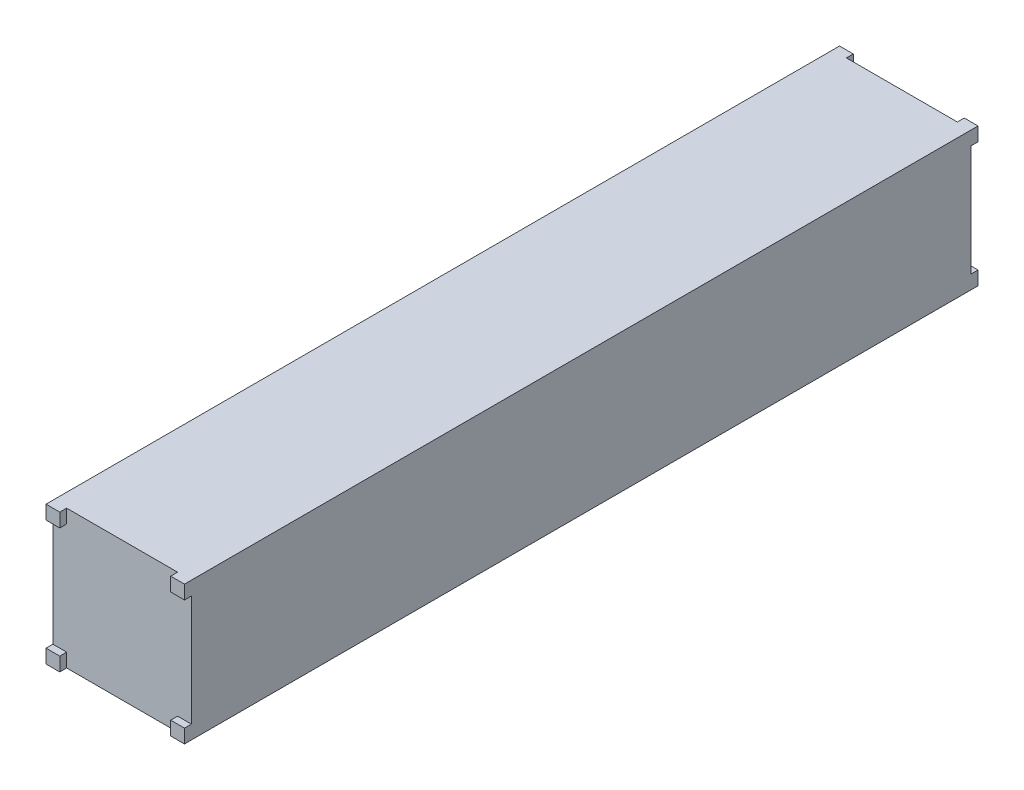
ISO-10303-21;
HEADER;
FILE_DESCRIPTION(('STEP AP214'),'2;1');
FILE_NAME('part.step','',(''),(''),'','','');
FILE_SCHEMA(('AUTOMOTIVE_DESIGN { 1 0 10303 214 1 1 1 1 }'));
ENDSEC;
DATA;
#1=APPLICATION_CONTEXT('core data for automotive mechanical design processes');
#2=APPLICATION_PROTOCOL_DEFINITION('international standard','automotive_design',2000,#1);
#3=PRODUCT_CONTEXT('',#1,'mechanical');
#4=PRODUCT('Part','Part','',(#3));
#5=PRODUCT_RELATED_PRODUCT_CATEGORY('part','',(#4));
#6=PRODUCT_DEFINITION_FORMATION('','',#4);
#7=PRODUCT_DEFINITION_CONTEXT('part definition',#1,'design');
#8=PRODUCT_DEFINITION('design','',#6,#7);
#9=PRODUCT_DEFINITION_SHAPE('','',#8);
#10=(LENGTH_UNIT() NAMED_UNIT(*) SI_UNIT(.MILLI.,.METRE.));
#11=(NAMED_UNIT(*) PLANE_ANGLE_UNIT() SI_UNIT($,.RADIAN.));
#12=(NAMED_UNIT(*) SI_UNIT($,.STERADIAN.) SOLID_ANGLE_UNIT());
#13=UNCERTAINTY_MEASURE_WITH_UNIT(LENGTH_MEASURE(1.E-05),#10,'distance_accuracy_value','');
#14=(GEOMETRIC_REPRESENTATION_CONTEXT(3) GLOBAL_UNCERTAINTY_ASSIGNED_CONTEXT((#13)) GLOBAL_UNIT_ASSIGNED_CONTEXT((#10,
#11,#12)) REPRESENTATION_CONTEXT('',''));
#15=CARTESIAN_POINT('',(0.,0.,0.));
#16=DIRECTION('',(0.,0.,1.));
#17=DIRECTION('',(1.,0.,0.));
#18=AXIS2_PLACEMENT_3D('',#15,#16,#17);
#19=CARTESIAN_POINT('',(0.,0.,-283.25));
#20=DIRECTION('',(0.,0.,1.));
#21=DIRECTION('',(1.,0.,0.));
#22=AXIS2_PLACEMENT_3D('',#19,#20,#21);
#23=PLANE('',#22);
#24=DIRECTION('',(0.,1.,0.));
#25=VECTOR('',#24,1.);
#26=CARTESIAN_POINT('',(40.3,-50.3,-283.25));
#27=LINE('',#26,#25);
#28=CARTESIAN_POINT('',(40.3,-50.3,-283.25));
#29=VERTEX_POINT('',#28);
#30=CARTESIAN_POINT('',(40.3,-40.3,-283.25));
#31=VERTEX_POINT('',#30);
#32=EDGE_CURVE('E240',#29,#31,#27,.T.);
#33=ORIENTED_EDGE('',*,*,#32,.F.);
#34=DIRECTION('',(1.,0.,0.));
#35=VECTOR('',#34,1.);
#36=CARTESIAN_POINT('',(50.3,-50.3,-283.25));
#37=LINE('',#36,#35);
#38=CARTESIAN_POINT('',(-40.2999999999999,-50.3,-283.25));
#39=VERTEX_POINT('',#38);
#40=EDGE_CURVE('E422',#39,#29,#37,.T.);
#41=ORIENTED_EDGE('',*,*,#40,.F.);
#42=DIRECTION('',(0.,-1.,0.));
#43=VECTOR('',#42,1.);
#44=CARTESIAN_POINT('',(-40.3,-50.3,-283.25));
#45=LINE('',#44,#43);
#46=CARTESIAN_POINT('',(-40.3,-40.3000000000001,-283.25));
#47=VERTEX_POINT('',#46);
#48=EDGE_CURVE('E256',#47,#39,#45,.T.);
#49=ORIENTED_EDGE('',*,*,#48,.F.);
#50=DIRECTION('',(1.,0.,0.));
#51=VECTOR('',#50,1.);
#52=CARTESIAN_POINT('',(-50.3,-40.3000000000001,-283.25));
#53=LINE('',#52,#51);
#54=CARTESIAN_POINT('',(-50.3,-40.3000000000001,-283.25));
#55=VERTEX_POINT('',#54);
#56=EDGE_CURVE('E251',#55,#47,#53,.T.);
#57=ORIENTED_EDGE('',*,*,#56,.F.);
#58=DIRECTION('',(0.,-1.,0.));
#59=VECTOR('',#58,1.);
#60=CARTESIAN_POINT('',(-50.3,-50.3,-283.25));
#61=LINE('',#60,#59);
#62=CARTESIAN_POINT('',(-50.3,40.3000000000001,-283.25));
#63=VERTEX_POINT('',#62);
#64=EDGE_CURVE('E409',#63,#55,#61,.T.);
#65=ORIENTED_EDGE('',*,*,#64,.F.);
#66=DIRECTION('',(-1.,0.,0.));
#67=VECTOR('',#66,1.);
#68=CARTESIAN_POINT('',(-50.3,40.3000000000001,-283.25));
#69=LINE('',#68,#67);
#70=CARTESIAN_POINT('',(-40.3,40.3000000000001,-283.25));
#71=VERTEX_POINT('',#70);
#72=EDGE_CURVE('E275',#71,#63,#69,.T.);
#73=ORIENTED_EDGE('',*,*,#72,.F.);
#74=DIRECTION('',(0.,-1.,0.));
#75=VECTOR('',#74,1.);
#76=CARTESIAN_POINT('',(-40.2999999999999,50.3000000000001,-283.25));
#77=LINE('',#76,#75);
#78=CARTESIAN_POINT('',(-40.2999999999999,50.3000000000001,-283.25));
#79=VERTEX_POINT('',#78);
#80=EDGE_CURVE('E270',#79,#71,#77,.T.);
#81=ORIENTED_EDGE('',*,*,#80,.F.);
#82=DIRECTION('',(-1.,0.,0.));
#83=VECTOR('',#82,1.);
#84=CARTESIAN_POINT('',(50.3,50.3,-283.25));
#85=LINE('',#84,#83);
#86=CARTESIAN_POINT('',(40.3,50.3,-283.25));
#87=VERTEX_POINT('',#86);
#88=EDGE_CURVE('E413',#87,#79,#85,.T.);
#89=ORIENTED_EDGE('',*,*,#88,.F.);
#90=DIRECTION('',(0.,1.,0.));
#91=VECTOR('',#90,1.);
#92=CARTESIAN_POINT('',(40.3,50.3,-283.25));
#93=LINE('',#92,#91);
#94=CARTESIAN_POINT('',(40.3,40.3,-283.25));
#95=VERTEX_POINT('',#94);
#96=EDGE_CURVE('E296',#95,#87,#93,.T.);
#97=ORIENTED_EDGE('',*,*,#96,.F.);
#98=DIRECTION('',(-1.,0.,0.));
#99=VECTOR('',#98,1.);
#100=CARTESIAN_POINT('',(50.3,40.3,-283.25));
#101=LINE('',#100,#99);
#102=CARTESIAN_POINT('',(50.3,40.3,-283.25));
#103=VERTEX_POINT('',#102);
#104=EDGE_CURVE('E291',#103,#95,#101,.T.);
#105=ORIENTED_EDGE('',*,*,#104,.F.);
#106=DIRECTION('',(0.,1.,0.));
#107=VECTOR('',#106,1.);
#108=CARTESIAN_POINT('',(50.3,-50.3,-283.25));
#109=LINE('',#108,#107);
#110=CARTESIAN_POINT('',(50.3,-40.3,-283.25));
#111=VERTEX_POINT('',#110);
#112=EDGE_CURVE('E424',#111,#103,#109,.T.);
#113=ORIENTED_EDGE('',*,*,#112,.F.);
#114=DIRECTION('',(1.,0.,0.));
#115=VECTOR('',#114,1.);
#116=CARTESIAN_POINT('',(50.3,-40.3,-283.25));
#117=LINE('',#116,#115);
#118=EDGE_CURVE('E238',#31,#111,#117,.T.);
#119=ORIENTED_EDGE('',*,*,#118,.F.);
#120=EDGE_LOOP('',(#33,#41,#49,#57,#65,#73,#81,#89,#97,#105,#113,#119));
#121=FACE_BOUND('',#120,.T.);
#122=ADVANCED_FACE('F33',(#121),#23,.F.);
#123=CARTESIAN_POINT('',(0.,0.,283.25));
#124=DIRECTION('',(0.,0.,1.));
#125=DIRECTION('',(1.,0.,0.));
#126=AXIS2_PLACEMENT_3D('',#123,#124,#125);
#127=PLANE('',#126);
#128=DIRECTION('',(-1.,0.,0.));
#129=VECTOR('',#128,1.);
#130=CARTESIAN_POINT('',(-50.3,-40.3,283.25));
#131=LINE('',#130,#129);
#132=CARTESIAN_POINT('',(-40.3,-40.3,283.25));
#133=VERTEX_POINT('',#132);
#134=CARTESIAN_POINT('',(-50.3,-40.3,283.25));
#135=VERTEX_POINT('',#134);
#136=EDGE_CURVE('E321',#133,#135,#131,.T.);
#137=ORIENTED_EDGE('',*,*,#136,.F.);
#138=DIRECTION('',(0.,1.,0.));
#139=VECTOR('',#138,1.);
#140=CARTESIAN_POINT('',(-40.3,-50.3,283.25));
#141=LINE('',#140,#139);
#142=CARTESIAN_POINT('',(-40.3,-50.3,283.25));
#143=VERTEX_POINT('',#142);
#144=EDGE_CURVE('E316',#143,#133,#141,.T.);
#145=ORIENTED_EDGE('',*,*,#144,.F.);
#146=DIRECTION('',(1.,0.,0.));
#147=VECTOR('',#146,1.);
#148=CARTESIAN_POINT('',(50.3,-50.3,283.25));
#149=LINE('',#148,#147);
#150=CARTESIAN_POINT('',(40.3,-50.3,283.25));
#151=VERTEX_POINT('',#150);
#152=EDGE_CURVE('E412',#143,#151,#149,.T.);
#153=ORIENTED_EDGE('',*,*,#152,.T.);
#154=DIRECTION('',(0.,-1.,0.));
#155=VECTOR('',#154,1.);
#156=CARTESIAN_POINT('',(40.3,-50.3,283.25));
#157=LINE('',#156,#155);
#158=CARTESIAN_POINT('',(40.3,-40.3,283.25));
#159=VERTEX_POINT('',#158);
#160=EDGE_CURVE('E343',#159,#151,#157,.T.);
#161=ORIENTED_EDGE('',*,*,#160,.F.);
#162=DIRECTION('',(-1.,0.,0.));
#163=VECTOR('',#162,1.);
#164=CARTESIAN_POINT('',(50.3,-40.3,283.25));
#165=LINE('',#164,#163);
#166=CARTESIAN_POINT('',(50.3,-40.3,283.25));
#167=VERTEX_POINT('',#166);
#168=EDGE_CURVE('E340',#167,#159,#165,.T.);
#169=ORIENTED_EDGE('',*,*,#168,.F.);
#170=DIRECTION('',(0.,1.,0.));
#171=VECTOR('',#170,1.);
#172=CARTESIAN_POINT('',(50.3,-50.3,283.25));
#173=LINE('',#172,#171);
#174=CARTESIAN_POINT('',(50.3,40.3,283.25));
#175=VERTEX_POINT('',#174);
#176=EDGE_CURVE('E415',#167,#175,#173,.T.);
#177=ORIENTED_EDGE('',*,*,#176,.T.);
#178=DIRECTION('',(1.,0.,0.));
#179=VECTOR('',#178,1.);
#180=CARTESIAN_POINT('',(50.3,40.3,283.25));
#181=LINE('',#180,#179);
#182=CARTESIAN_POINT('',(40.3,40.3,283.25));
#183=VERTEX_POINT('',#182);
#184=EDGE_CURVE('E367',#183,#175,#181,.T.);
#185=ORIENTED_EDGE('',*,*,#184,.F.);
#186=DIRECTION('',(0.,-1.,0.));
#187=VECTOR('',#186,1.);
#188=CARTESIAN_POINT('',(40.3,50.3,283.25));
#189=LINE('',#188,#187);
#190=CARTESIAN_POINT('',(40.3,50.3,283.25));
#191=VERTEX_POINT('',#190);
#192=EDGE_CURVE('E362',#191,#183,#189,.T.);
#193=ORIENTED_EDGE('',*,*,#192,.F.);
#194=DIRECTION('',(-1.,0.,0.));
#195=VECTOR('',#194,1.);
#196=CARTESIAN_POINT('',(50.3,50.3,283.25));
#197=LINE('',#196,#195);
#198=CARTESIAN_POINT('',(-40.2999999999999,50.3,283.25));
#199=VERTEX_POINT('',#198);
#200=EDGE_CURVE('E417',#191,#199,#197,.T.);
#201=ORIENTED_EDGE('',*,*,#200,.T.);
#202=DIRECTION('',(0.,1.,0.));
#203=VECTOR('',#202,1.);
#204=CARTESIAN_POINT('',(-40.3,50.3,283.25));
#205=LINE('',#204,#203);
#206=CARTESIAN_POINT('',(-40.3,40.3,283.25));
#207=VERTEX_POINT('',#206);
#208=EDGE_CURVE('E389',#207,#199,#205,.T.);
#209=ORIENTED_EDGE('',*,*,#208,.F.);
#210=DIRECTION('',(1.,0.,0.));
#211=VECTOR('',#210,1.);
#212=CARTESIAN_POINT('',(-50.3,40.3,283.25));
#213=LINE('',#212,#211);
#214=CARTESIAN_POINT('',(-50.3,40.3,283.25));
#215=VERTEX_POINT('',#214);
#216=EDGE_CURVE('E384',#215,#207,#213,.T.);
#217=ORIENTED_EDGE('',*,*,#216,.F.);
#218=DIRECTION('',(0.,-1.,0.));
#219=VECTOR('',#218,1.);
#220=CARTESIAN_POINT('',(-50.3,-50.3,283.25));
#221=LINE('',#220,#219);
#222=EDGE_CURVE('E410',#215,#135,#221,.T.);
#223=ORIENTED_EDGE('',*,*,#222,.T.);
#224=EDGE_LOOP('',(#137,#145,#153,#161,#169,#177,#185,#193,#201,#209,#217,#223));
#225=FACE_BOUND('',#224,.T.);
#226=ADVANCED_FACE('F484',(#225),#127,.T.);
#227=CARTESIAN_POINT('',(-50.3,-50.3,283.25));
#228=DIRECTION('',(1.,0.,0.));
#229=DIRECTION('',(0.,0.,-1.));
#230=AXIS2_PLACEMENT_3D('',#227,#228,#229);
#231=PLANE('',#230);
#232=DIRECTION('',(0.,0.,-1.));
#233=VECTOR('',#232,1.);
#234=CARTESIAN_POINT('',(-50.3,50.3,283.25));
#235=LINE('',#234,#233);
#236=CARTESIAN_POINT('',(-50.3,50.3,288.25));
#237=VERTEX_POINT('',#236);
#238=CARTESIAN_POINT('',(-50.2999999999999,50.3000000000001,-288.25));
#239=VERTEX_POINT('',#238);
#240=EDGE_CURVE('E419',#237,#239,#235,.T.);
#241=ORIENTED_EDGE('',*,*,#240,.T.);
#242=DIRECTION('',(0.,1.,0.));
#243=VECTOR('',#242,1.);
#244=CARTESIAN_POINT('',(-50.2999999999999,50.3000000000001,-288.25));
#245=LINE('',#244,#243);
#246=CARTESIAN_POINT('',(-50.3,40.3000000000001,-288.25));
#247=VERTEX_POINT('',#246);
#248=EDGE_CURVE('E271',#247,#239,#245,.T.);
#249=ORIENTED_EDGE('',*,*,#248,.F.);
#250=DIRECTION('',(0.,0.,1.));
#251=VECTOR('',#250,1.);
#252=CARTESIAN_POINT('',(-50.3,40.3000000000001,-288.25));
#253=LINE('',#252,#251);
#254=EDGE_CURVE('E281',#247,#63,#253,.T.);
#255=ORIENTED_EDGE('',*,*,#254,.T.);
#256=ORIENTED_EDGE('',*,*,#64,.T.);
#257=DIRECTION('',(0.,0.,1.));
#258=VECTOR('',#257,1.);
#259=CARTESIAN_POINT('',(-50.3,-40.3000000000001,-288.25));
#260=LINE('',#259,#258);
#261=CARTESIAN_POINT('',(-50.3,-40.3000000000001,-288.25));
#262=VERTEX_POINT('',#261);
#263=EDGE_CURVE('E268',#262,#55,#260,.T.);
#264=ORIENTED_EDGE('',*,*,#263,.F.);
#265=DIRECTION('',(0.,1.,0.));
#266=VECTOR('',#265,1.);
#267=CARTESIAN_POINT('',(-50.3,-50.3000000000001,-288.25));
#268=LINE('',#267,#266);
#269=CARTESIAN_POINT('',(-50.3,-50.3000000000001,-288.25));
#270=VERTEX_POINT('',#269);
#271=EDGE_CURVE('E255',#270,#262,#268,.T.);
#272=ORIENTED_EDGE('',*,*,#271,.F.);
#273=DIRECTION('',(0.,0.,-1.));
#274=VECTOR('',#273,1.);
#275=CARTESIAN_POINT('',(-50.3,-50.3,283.25));
#276=LINE('',#275,#274);
#277=CARTESIAN_POINT('',(-50.3,-50.3,288.25));
#278=VERTEX_POINT('',#277);
#279=EDGE_CURVE('E11',#278,#270,#276,.T.);
#280=ORIENTED_EDGE('',*,*,#279,.F.);
#281=DIRECTION('',(0.,-1.,0.));
#282=VECTOR('',#281,1.);
#283=CARTESIAN_POINT('',(-50.3,-50.3,288.25));
#284=LINE('',#283,#282);
#285=CARTESIAN_POINT('',(-50.3,-40.3,288.25));
#286=VERTEX_POINT('',#285);
#287=EDGE_CURVE('E317',#286,#278,#284,.T.);
#288=ORIENTED_EDGE('',*,*,#287,.F.);
#289=DIRECTION('',(0.,0.,-1.));
#290=VECTOR('',#289,1.);
#291=CARTESIAN_POINT('',(-50.3,-40.3,288.25));
#292=LINE('',#291,#290);
#293=EDGE_CURVE('E327',#286,#135,#292,.T.);
#294=ORIENTED_EDGE('',*,*,#293,.T.);
#295=ORIENTED_EDGE('',*,*,#222,.F.);
#296=DIRECTION('',(0.,0.,-1.));
#297=VECTOR('',#296,1.);
#298=CARTESIAN_POINT('',(-50.3,40.3,288.25));
#299=LINE('',#298,#297);
#300=CARTESIAN_POINT('',(-50.3,40.3,288.25));
#301=VERTEX_POINT('',#300);
#302=EDGE_CURVE('E406',#301,#215,#299,.T.);
#303=ORIENTED_EDGE('',*,*,#302,.F.);
#304=DIRECTION('',(0.,-1.,0.));
#305=VECTOR('',#304,1.);
#306=CARTESIAN_POINT('',(-50.3,50.3,288.25));
#307=LINE('',#306,#305);
#308=EDGE_CURVE('E385',#237,#301,#307,.T.);
#309=ORIENTED_EDGE('',*,*,#308,.F.);
#310=EDGE_LOOP('',(#241,#249,#255,#256,#264,#272,#280,#288,#294,#295,#303,#309));
#311=FACE_BOUND('',#310,.T.);
#312=ADVANCED_FACE('F35',(#311),#231,.F.);
#313=CARTESIAN_POINT('',(50.3,-50.3,283.25));
#314=DIRECTION('',(0.,1.,0.));
#315=DIRECTION('',(0.,0.,1.));
#316=AXIS2_PLACEMENT_3D('',#313,#314,#315);
#317=PLANE('',#316);
#318=ORIENTED_EDGE('',*,*,#279,.T.);
#319=DIRECTION('',(-1.,0.,0.));
#320=VECTOR('',#319,1.);
#321=CARTESIAN_POINT('',(-50.3,-50.3000000000001,-288.25));
#322=LINE('',#321,#320);
#323=CARTESIAN_POINT('',(-40.3,-50.3,-288.25));
#324=VERTEX_POINT('',#323);
#325=EDGE_CURVE('E252',#324,#270,#322,.T.);
#326=ORIENTED_EDGE('',*,*,#325,.F.);
#327=DIRECTION('',(0.,0.,1.));
#328=VECTOR('',#327,1.);
#329=CARTESIAN_POINT('',(-40.3,-50.3,-288.25));
#330=LINE('',#329,#328);
#331=EDGE_CURVE('E56',#324,#39,#330,.T.);
#332=ORIENTED_EDGE('',*,*,#331,.T.);
#333=ORIENTED_EDGE('',*,*,#40,.T.);
#334=DIRECTION('',(0.,0.,1.));
#335=VECTOR('',#334,1.);
#336=CARTESIAN_POINT('',(40.3,-50.3,-288.25));
#337=LINE('',#336,#335);
#338=CARTESIAN_POINT('',(40.3,-50.3,-288.25));
#339=VERTEX_POINT('',#338);
#340=EDGE_CURVE('E230',#339,#29,#337,.T.);
#341=ORIENTED_EDGE('',*,*,#340,.F.);
#342=DIRECTION('',(-1.,0.,0.));
#343=VECTOR('',#342,1.);
#344=CARTESIAN_POINT('',(50.3,-50.3,-288.25));
#345=LINE('',#344,#343);
#346=CARTESIAN_POINT('',(50.3,-50.3,-288.25));
#347=VERTEX_POINT('',#346);
#348=EDGE_CURVE('E228',#347,#339,#345,.T.);
#349=ORIENTED_EDGE('',*,*,#348,.F.);
#350=DIRECTION('',(0.,0.,-1.));
#351=VECTOR('',#350,1.);
#352=CARTESIAN_POINT('',(50.3,-50.3,283.25));
#353=LINE('',#352,#351);
#354=CARTESIAN_POINT('',(50.3,-50.3,288.25));
#355=VERTEX_POINT('',#354);
#356=EDGE_CURVE('E41',#355,#347,#353,.T.);
#357=ORIENTED_EDGE('',*,*,#356,.F.);
#358=DIRECTION('',(1.,0.,0.));
#359=VECTOR('',#358,1.);
#360=CARTESIAN_POINT('',(50.3,-50.3,288.25));
#361=LINE('',#360,#359);
#362=CARTESIAN_POINT('',(40.3,-50.3,288.25));
#363=VERTEX_POINT('',#362);
#364=EDGE_CURVE('E341',#363,#355,#361,.T.);
#365=ORIENTED_EDGE('',*,*,#364,.F.);
#366=DIRECTION('',(0.,0.,-1.));
#367=VECTOR('',#366,1.);
#368=CARTESIAN_POINT('',(40.3,-50.3,288.25));
#369=LINE('',#368,#367);
#370=EDGE_CURVE('E349',#363,#151,#369,.T.);
#371=ORIENTED_EDGE('',*,*,#370,.T.);
#372=ORIENTED_EDGE('',*,*,#152,.F.);
#373=DIRECTION('',(0.,0.,-1.));
#374=VECTOR('',#373,1.);
#375=CARTESIAN_POINT('',(-40.3,-50.3,288.25));
#376=LINE('',#375,#374);
#377=CARTESIAN_POINT('',(-40.3,-50.3,288.25));
#378=VERTEX_POINT('',#377);
#379=EDGE_CURVE('E337',#378,#143,#376,.T.);
#380=ORIENTED_EDGE('',*,*,#379,.F.);
#381=DIRECTION('',(1.,0.,0.));
#382=VECTOR('',#381,1.);
#383=CARTESIAN_POINT('',(-50.3,-50.3,288.25));
#384=LINE('',#383,#382);
#385=EDGE_CURVE('E320',#278,#378,#384,.T.);
#386=ORIENTED_EDGE('',*,*,#385,.F.);
#387=EDGE_LOOP('',(#318,#326,#332,#333,#341,#349,#357,#365,#371,#372,#380,#386));
#388=FACE_BOUND('',#387,.T.);
#389=ADVANCED_FACE('F229',(#388),#317,.F.);
#390=CARTESIAN_POINT('',(50.3,-50.3,283.25));
#391=DIRECTION('',(-1.,0.,0.));
#392=DIRECTION('',(0.,0.,1.));
#393=AXIS2_PLACEMENT_3D('',#390,#391,#392);
#394=PLANE('',#393);
#395=ORIENTED_EDGE('',*,*,#356,.T.);
#396=DIRECTION('',(0.,-1.,0.));
#397=VECTOR('',#396,1.);
#398=CARTESIAN_POINT('',(50.3,-50.3,-288.25));
#399=LINE('',#398,#397);
#400=CARTESIAN_POINT('',(50.3,-40.3,-288.25));
#401=VERTEX_POINT('',#400);
#402=EDGE_CURVE('E221',#401,#347,#399,.T.);
#403=ORIENTED_EDGE('',*,*,#402,.F.);
#404=DIRECTION('',(0.,0.,1.));
#405=VECTOR('',#404,1.);
#406=CARTESIAN_POINT('',(50.3,-40.3,-288.25));
#407=LINE('',#406,#405);
#408=EDGE_CURVE('E48',#401,#111,#407,.T.);
#409=ORIENTED_EDGE('',*,*,#408,.T.);
#410=ORIENTED_EDGE('',*,*,#112,.T.);
#411=DIRECTION('',(0.,0.,1.));
#412=VECTOR('',#411,1.);
#413=CARTESIAN_POINT('',(50.3,40.3,-288.25));
#414=LINE('',#413,#412);
#415=CARTESIAN_POINT('',(50.3,40.3,-288.25));
#416=VERTEX_POINT('',#415);
#417=EDGE_CURVE('E313',#416,#103,#414,.T.);
#418=ORIENTED_EDGE('',*,*,#417,.F.);
#419=DIRECTION('',(0.,-1.,0.));
#420=VECTOR('',#419,1.);
#421=CARTESIAN_POINT('',(50.3,50.3,-288.25));
#422=LINE('',#421,#420);
#423=CARTESIAN_POINT('',(50.3,50.3,-288.25));
#424=VERTEX_POINT('',#423);
#425=EDGE_CURVE('E292',#424,#416,#422,.T.);
#426=ORIENTED_EDGE('',*,*,#425,.F.);
#427=DIRECTION('',(0.,0.,-1.));
#428=VECTOR('',#427,1.);
#429=CARTESIAN_POINT('',(50.3,50.3,283.25));
#430=LINE('',#429,#428);
#431=CARTESIAN_POINT('',(50.3,50.3,288.25));
#432=VERTEX_POINT('',#431);
#433=EDGE_CURVE('E226',#432,#424,#430,.T.);
#434=ORIENTED_EDGE('',*,*,#433,.F.);
#435=DIRECTION('',(0.,1.,0.));
#436=VECTOR('',#435,1.);
#437=CARTESIAN_POINT('',(50.3,50.3,288.25));
#438=LINE('',#437,#436);
#439=CARTESIAN_POINT('',(50.3,40.3,288.25));
#440=VERTEX_POINT('',#439);
#441=EDGE_CURVE('E363',#440,#432,#438,.T.);
#442=ORIENTED_EDGE('',*,*,#441,.F.);
#443=DIRECTION('',(0.,0.,-1.));
#444=VECTOR('',#443,1.);
#445=CARTESIAN_POINT('',(50.3,40.3,288.25));
#446=LINE('',#445,#444);
#447=EDGE_CURVE('E373',#440,#175,#446,.T.);
#448=ORIENTED_EDGE('',*,*,#447,.T.);
#449=ORIENTED_EDGE('',*,*,#176,.F.);
#450=DIRECTION('',(0.,0.,-1.));
#451=VECTOR('',#450,1.);
#452=CARTESIAN_POINT('',(50.3,-40.3,288.25));
#453=LINE('',#452,#451);
#454=CARTESIAN_POINT('',(50.3,-40.3,288.25));
#455=VERTEX_POINT('',#454);
#456=EDGE_CURVE('E359',#455,#167,#453,.T.);
#457=ORIENTED_EDGE('',*,*,#456,.F.);
#458=DIRECTION('',(0.,1.,0.));
#459=VECTOR('',#458,1.);
#460=CARTESIAN_POINT('',(50.3,-50.3,288.25));
#461=LINE('',#460,#459);
#462=EDGE_CURVE('E223',#355,#455,#461,.T.);
#463=ORIENTED_EDGE('',*,*,#462,.F.);
#464=EDGE_LOOP('',(#395,#403,#409,#410,#418,#426,#434,#442,#448,#449,#457,#463));
#465=FACE_BOUND('',#464,.T.);
#466=ADVANCED_FACE('F219',(#465),#394,.F.);
#467=CARTESIAN_POINT('',(50.3,50.3,283.25));
#468=DIRECTION('',(0.,-1.,0.));
#469=DIRECTION('',(1.,0.,0.));
#470=AXIS2_PLACEMENT_3D('',#467,#468,#469);
#471=PLANE('',#470);
#472=ORIENTED_EDGE('',*,*,#433,.T.);
#473=DIRECTION('',(1.,0.,0.));
#474=VECTOR('',#473,1.);
#475=CARTESIAN_POINT('',(50.3,50.3,-288.25));
#476=LINE('',#475,#474);
#477=CARTESIAN_POINT('',(40.3,50.3,-288.25));
#478=VERTEX_POINT('',#477);
#479=EDGE_CURVE('E300',#478,#424,#476,.T.);
#480=ORIENTED_EDGE('',*,*,#479,.F.);
#481=DIRECTION('',(0.,0.,1.));
#482=VECTOR('',#481,1.);
#483=CARTESIAN_POINT('',(40.3,50.3,-288.25));
#484=LINE('',#483,#482);
#485=EDGE_CURVE('E303',#478,#87,#484,.T.);
#486=ORIENTED_EDGE('',*,*,#485,.T.);
#487=ORIENTED_EDGE('',*,*,#88,.T.);
#488=DIRECTION('',(0.,0.,1.));
#489=VECTOR('',#488,1.);
#490=CARTESIAN_POINT('',(-40.2999999999999,50.3000000000001,-288.25));
#491=LINE('',#490,#489);
#492=CARTESIAN_POINT('',(-40.2999999999999,50.3000000000001,-288.25));
#493=VERTEX_POINT('',#492);
#494=EDGE_CURVE('E289',#493,#79,#491,.T.);
#495=ORIENTED_EDGE('',*,*,#494,.F.);
#496=DIRECTION('',(1.,0.,0.));
#497=VECTOR('',#496,1.);
#498=CARTESIAN_POINT('',(-50.2999999999999,50.3000000000001,-288.25));
#499=LINE('',#498,#497);
#500=EDGE_CURVE('E274',#239,#493,#499,.T.);
#501=ORIENTED_EDGE('',*,*,#500,.F.);
#502=ORIENTED_EDGE('',*,*,#240,.F.);
#503=DIRECTION('',(-1.,0.,0.));
#504=VECTOR('',#503,1.);
#505=CARTESIAN_POINT('',(-50.3,50.3,288.25));
#506=LINE('',#505,#504);
#507=CARTESIAN_POINT('',(-40.3,50.3,288.25));
#508=VERTEX_POINT('',#507);
#509=EDGE_CURVE('E393',#508,#237,#506,.T.);
#510=ORIENTED_EDGE('',*,*,#509,.F.);
#511=DIRECTION('',(0.,0.,-1.));
#512=VECTOR('',#511,1.);
#513=CARTESIAN_POINT('',(-40.3,50.3,288.25));
#514=LINE('',#513,#512);
#515=EDGE_CURVE('E396',#508,#199,#514,.T.);
#516=ORIENTED_EDGE('',*,*,#515,.T.);
#517=ORIENTED_EDGE('',*,*,#200,.F.);
#518=DIRECTION('',(0.,0.,-1.));
#519=VECTOR('',#518,1.);
#520=CARTESIAN_POINT('',(40.3,50.3,288.25));
#521=LINE('',#520,#519);
#522=CARTESIAN_POINT('',(40.3,50.3,288.25));
#523=VERTEX_POINT('',#522);
#524=EDGE_CURVE('E382',#523,#191,#521,.T.);
#525=ORIENTED_EDGE('',*,*,#524,.F.);
#526=DIRECTION('',(-1.,0.,0.));
#527=VECTOR('',#526,1.);
#528=CARTESIAN_POINT('',(50.3,50.3,288.25));
#529=LINE('',#528,#527);
#530=EDGE_CURVE('E366',#432,#523,#529,.T.);
#531=ORIENTED_EDGE('',*,*,#530,.F.);
#532=EDGE_LOOP('',(#472,#480,#486,#487,#495,#501,#502,#510,#516,#517,#525,#531));
#533=FACE_BOUND('',#532,.T.);
#534=ADVANCED_FACE('F432',(#533),#471,.F.);
#535=CARTESIAN_POINT('',(-50.3,40.3,288.25));
#536=DIRECTION('',(0.,1.,0.));
#537=DIRECTION('',(0.,0.,1.));
#538=AXIS2_PLACEMENT_3D('',#535,#536,#537);
#539=PLANE('',#538);
#540=ORIENTED_EDGE('',*,*,#216,.T.);
#541=DIRECTION('',(0.,0.,-1.));
#542=VECTOR('',#541,1.);
#543=CARTESIAN_POINT('',(-40.3,40.3,288.25));
#544=LINE('',#543,#542);
#545=CARTESIAN_POINT('',(-40.3,40.3,288.25));
#546=VERTEX_POINT('',#545);
#547=EDGE_CURVE('E403',#546,#207,#544,.T.);
#548=ORIENTED_EDGE('',*,*,#547,.F.);
#549=DIRECTION('',(1.,0.,0.));
#550=VECTOR('',#549,1.);
#551=CARTESIAN_POINT('',(-50.3,40.3,288.25));
#552=LINE('',#551,#550);
#553=EDGE_CURVE('E388',#301,#546,#552,.T.);
#554=ORIENTED_EDGE('',*,*,#553,.F.);
#555=ORIENTED_EDGE('',*,*,#302,.T.);
#556=EDGE_LOOP('',(#540,#548,#554,#555));
#557=FACE_BOUND('',#556,.T.);
#558=ADVANCED_FACE('F476',(#557),#539,.F.);
#559=CARTESIAN_POINT('',(-40.3,50.3,288.25));
#560=DIRECTION('',(-1.,0.,0.));
#561=DIRECTION('',(0.,0.,1.));
#562=AXIS2_PLACEMENT_3D('',#559,#560,#561);
#563=PLANE('',#562);
#564=ORIENTED_EDGE('',*,*,#208,.T.);
#565=ORIENTED_EDGE('',*,*,#515,.F.);
#566=DIRECTION('',(0.,1.,0.));
#567=VECTOR('',#566,1.);
#568=CARTESIAN_POINT('',(-40.3,50.3,288.25));
#569=LINE('',#568,#567);
#570=EDGE_CURVE('E391',#546,#508,#569,.T.);
#571=ORIENTED_EDGE('',*,*,#570,.F.);
#572=ORIENTED_EDGE('',*,*,#547,.T.);
#573=EDGE_LOOP('',(#564,#565,#571,#572));
#574=FACE_BOUND('',#573,.T.);
#575=ADVANCED_FACE('F479',(#574),#563,.F.);
#576=CARTESIAN_POINT('',(0.,0.,288.25));
#577=DIRECTION('',(0.,0.,1.));
#578=DIRECTION('',(1.,0.,0.));
#579=AXIS2_PLACEMENT_3D('',#576,#577,#578);
#580=PLANE('',#579);
#581=ORIENTED_EDGE('',*,*,#308,.T.);
#582=ORIENTED_EDGE('',*,*,#553,.T.);
#583=ORIENTED_EDGE('',*,*,#570,.T.);
#584=ORIENTED_EDGE('',*,*,#509,.T.);
#585=EDGE_LOOP('',(#581,#582,#583,#584));
#586=FACE_BOUND('',#585,.T.);
#587=ADVANCED_FACE('F470',(#586),#580,.T.);
#588=CARTESIAN_POINT('',(40.3,50.3,288.25));
#589=DIRECTION('',(1.,0.,0.));
#590=DIRECTION('',(0.,0.,-1.));
#591=AXIS2_PLACEMENT_3D('',#588,#589,#590);
#592=PLANE('',#591);
#593=ORIENTED_EDGE('',*,*,#192,.T.);
#594=DIRECTION('',(0.,0.,-1.));
#595=VECTOR('',#594,1.);
#596=CARTESIAN_POINT('',(40.3,40.3,288.25));
#597=LINE('',#596,#595);
#598=CARTESIAN_POINT('',(40.3,40.3,288.25));
#599=VERTEX_POINT('',#598);
#600=EDGE_CURVE('E380',#599,#183,#597,.T.);
#601=ORIENTED_EDGE('',*,*,#600,.F.);
#602=DIRECTION('',(0.,-1.,0.));
#603=VECTOR('',#602,1.);
#604=CARTESIAN_POINT('',(40.3,50.3,288.25));
#605=LINE('',#604,#603);
#606=EDGE_CURVE('E369',#523,#599,#605,.T.);
#607=ORIENTED_EDGE('',*,*,#606,.F.);
#608=ORIENTED_EDGE('',*,*,#524,.T.);
#609=EDGE_LOOP('',(#593,#601,#607,#608));
#610=FACE_BOUND('',#609,.T.);
#611=ADVANCED_FACE('F488',(#610),#592,.F.);
#612=CARTESIAN_POINT('',(50.3,40.3,288.25));
#613=DIRECTION('',(0.,1.,0.));
#614=DIRECTION('',(-1.,0.,0.));
#615=AXIS2_PLACEMENT_3D('',#612,#613,#614);
#616=PLANE('',#615);
#617=ORIENTED_EDGE('',*,*,#184,.T.);
#618=ORIENTED_EDGE('',*,*,#447,.F.);
#619=DIRECTION('',(1.,0.,0.));
#620=VECTOR('',#619,1.);
#621=CARTESIAN_POINT('',(50.3,40.3,288.25));
#622=LINE('',#621,#620);
#623=EDGE_CURVE('E371',#599,#440,#622,.T.);
#624=ORIENTED_EDGE('',*,*,#623,.F.);
#625=ORIENTED_EDGE('',*,*,#600,.T.);
#626=EDGE_LOOP('',(#617,#618,#624,#625));
#627=FACE_BOUND('',#626,.T.);
#628=ADVANCED_FACE('F495',(#627),#616,.F.);
#629=CARTESIAN_POINT('',(0.,0.,288.25));
#630=DIRECTION('',(0.,0.,-1.));
#631=DIRECTION('',(-1.,0.,0.));
#632=AXIS2_PLACEMENT_3D('',#629,#630,#631);
#633=PLANE('',#632);
#634=ORIENTED_EDGE('',*,*,#441,.T.);
#635=ORIENTED_EDGE('',*,*,#530,.T.);
#636=ORIENTED_EDGE('',*,*,#606,.T.);
#637=ORIENTED_EDGE('',*,*,#623,.T.);
#638=EDGE_LOOP('',(#634,#635,#636,#637));
#639=FACE_BOUND('',#638,.T.);
#640=ADVANCED_FACE('F491',(#639),#633,.F.);
#641=CARTESIAN_POINT('',(50.3,-40.3,288.25));
#642=DIRECTION('',(0.,-1.,0.));
#643=DIRECTION('',(1.,0.,0.));
#644=AXIS2_PLACEMENT_3D('',#641,#642,#643);
#645=PLANE('',#644);
#646=ORIENTED_EDGE('',*,*,#168,.T.);
#647=DIRECTION('',(0.,0.,-1.));
#648=VECTOR('',#647,1.);
#649=CARTESIAN_POINT('',(40.3,-40.3,288.25));
#650=LINE('',#649,#648);
#651=CARTESIAN_POINT('',(40.3,-40.3,288.25));
#652=VERTEX_POINT('',#651);
#653=EDGE_CURVE('E356',#652,#159,#650,.T.);
#654=ORIENTED_EDGE('',*,*,#653,.F.);
#655=DIRECTION('',(-1.,0.,0.));
#656=VECTOR('',#655,1.);
#657=CARTESIAN_POINT('',(50.3,-40.3,288.25));
#658=LINE('',#657,#656);
#659=EDGE_CURVE('E345',#455,#652,#658,.T.);
#660=ORIENTED_EDGE('',*,*,#659,.F.);
#661=ORIENTED_EDGE('',*,*,#456,.T.);
#662=EDGE_LOOP('',(#646,#654,#660,#661));
#663=FACE_BOUND('',#662,.T.);
#664=ADVANCED_FACE('F502',(#663),#645,.F.);
#665=CARTESIAN_POINT('',(40.3,-50.3,288.25));
#666=DIRECTION('',(1.,0.,0.));
#667=DIRECTION('',(0.,0.,-1.));
#668=AXIS2_PLACEMENT_3D('',#665,#666,#667);
#669=PLANE('',#668);
#670=ORIENTED_EDGE('',*,*,#160,.T.);
#671=ORIENTED_EDGE('',*,*,#370,.F.);
#672=DIRECTION('',(0.,-1.,0.));
#673=VECTOR('',#672,1.);
#674=CARTESIAN_POINT('',(40.3,-50.3,288.25));
#675=LINE('',#674,#673);
#676=EDGE_CURVE('E347',#652,#363,#675,.T.);
#677=ORIENTED_EDGE('',*,*,#676,.F.);
#678=ORIENTED_EDGE('',*,*,#653,.T.);
#679=EDGE_LOOP('',(#670,#671,#677,#678));
#680=FACE_BOUND('',#679,.T.);
#681=ADVANCED_FACE('F577',(#680),#669,.F.);
#682=CARTESIAN_POINT('',(0.,0.,288.25));
#683=DIRECTION('',(0.,0.,-1.));
#684=DIRECTION('',(-1.,0.,0.));
#685=AXIS2_PLACEMENT_3D('',#682,#683,#684);
#686=PLANE('',#685);
#687=ORIENTED_EDGE('',*,*,#364,.T.);
#688=ORIENTED_EDGE('',*,*,#462,.T.);
#689=ORIENTED_EDGE('',*,*,#659,.T.);
#690=ORIENTED_EDGE('',*,*,#676,.T.);
#691=EDGE_LOOP('',(#687,#688,#689,#690));
#692=FACE_BOUND('',#691,.T.);
#693=ADVANCED_FACE('F587',(#692),#686,.F.);
#694=CARTESIAN_POINT('',(-40.3,-50.3,288.25));
#695=DIRECTION('',(-1.,0.,0.));
#696=DIRECTION('',(0.,0.,1.));
#697=AXIS2_PLACEMENT_3D('',#694,#695,#696);
#698=PLANE('',#697);
#699=ORIENTED_EDGE('',*,*,#144,.T.);
#700=DIRECTION('',(0.,0.,-1.));
#701=VECTOR('',#700,1.);
#702=CARTESIAN_POINT('',(-40.3,-40.3,288.25));
#703=LINE('',#702,#701);
#704=CARTESIAN_POINT('',(-40.3,-40.3,288.25));
#705=VERTEX_POINT('',#704);
#706=EDGE_CURVE('E334',#705,#133,#703,.T.);
#707=ORIENTED_EDGE('',*,*,#706,.F.);
#708=DIRECTION('',(0.,1.,0.));
#709=VECTOR('',#708,1.);
#710=CARTESIAN_POINT('',(-40.3,-50.3,288.25));
#711=LINE('',#710,#709);
#712=EDGE_CURVE('E323',#378,#705,#711,.T.);
#713=ORIENTED_EDGE('',*,*,#712,.F.);
#714=ORIENTED_EDGE('',*,*,#379,.T.);
#715=EDGE_LOOP('',(#699,#707,#713,#714));
#716=FACE_BOUND('',#715,.T.);
#717=ADVANCED_FACE('F597',(#716),#698,.F.);
#718=CARTESIAN_POINT('',(-50.3,-40.3,288.25));
#719=DIRECTION('',(0.,-1.,0.));
#720=DIRECTION('',(0.,0.,-1.));
#721=AXIS2_PLACEMENT_3D('',#718,#719,#720);
#722=PLANE('',#721);
#723=ORIENTED_EDGE('',*,*,#136,.T.);
#724=ORIENTED_EDGE('',*,*,#293,.F.);
#725=DIRECTION('',(-1.,0.,0.));
#726=VECTOR('',#725,1.);
#727=CARTESIAN_POINT('',(-50.3,-40.3,288.25));
#728=LINE('',#727,#726);
#729=EDGE_CURVE('E325',#705,#286,#728,.T.);
#730=ORIENTED_EDGE('',*,*,#729,.F.);
#731=ORIENTED_EDGE('',*,*,#706,.T.);
#732=EDGE_LOOP('',(#723,#724,#730,#731));
#733=FACE_BOUND('',#732,.T.);
#734=ADVANCED_FACE('F607',(#733),#722,.F.);
#735=CARTESIAN_POINT('',(0.,0.,288.25));
#736=DIRECTION('',(0.,0.,-1.));
#737=DIRECTION('',(-1.,0.,0.));
#738=AXIS2_PLACEMENT_3D('',#735,#736,#737);
#739=PLANE('',#738);
#740=ORIENTED_EDGE('',*,*,#287,.T.);
#741=ORIENTED_EDGE('',*,*,#385,.T.);
#742=ORIENTED_EDGE('',*,*,#712,.T.);
#743=ORIENTED_EDGE('',*,*,#729,.T.);
#744=EDGE_LOOP('',(#740,#741,#742,#743));
#745=FACE_BOUND('',#744,.T.);
#746=ADVANCED_FACE('F617',(#745),#739,.F.);
#747=CARTESIAN_POINT('',(50.3,40.3,-288.25));
#748=DIRECTION('',(0.,1.,0.));
#749=DIRECTION('',(0.,0.,1.));
#750=AXIS2_PLACEMENT_3D('',#747,#748,#749);
#751=PLANE('',#750);
#752=ORIENTED_EDGE('',*,*,#104,.T.);
#753=DIRECTION('',(0.,0.,1.));
#754=VECTOR('',#753,1.);
#755=CARTESIAN_POINT('',(40.3,40.3,-288.25));
#756=LINE('',#755,#754);
#757=CARTESIAN_POINT('',(40.3,40.3,-288.25));
#758=VERTEX_POINT('',#757);
#759=EDGE_CURVE('E310',#758,#95,#756,.T.);
#760=ORIENTED_EDGE('',*,*,#759,.F.);
#761=DIRECTION('',(-1.,0.,0.));
#762=VECTOR('',#761,1.);
#763=CARTESIAN_POINT('',(50.3,40.3,-288.25));
#764=LINE('',#763,#762);
#765=EDGE_CURVE('E295',#416,#758,#764,.T.);
#766=ORIENTED_EDGE('',*,*,#765,.F.);
#767=ORIENTED_EDGE('',*,*,#417,.T.);
#768=EDGE_LOOP('',(#752,#760,#766,#767));
#769=FACE_BOUND('',#768,.T.);
#770=ADVANCED_FACE('F444',(#769),#751,.F.);
#771=CARTESIAN_POINT('',(40.3,50.3,-288.25));
#772=DIRECTION('',(1.,0.,0.));
#773=DIRECTION('',(0.,0.,-1.));
#774=AXIS2_PLACEMENT_3D('',#771,#772,#773);
#775=PLANE('',#774);
#776=ORIENTED_EDGE('',*,*,#96,.T.);
#777=ORIENTED_EDGE('',*,*,#485,.F.);
#778=DIRECTION('',(0.,1.,0.));
#779=VECTOR('',#778,1.);
#780=CARTESIAN_POINT('',(40.3,50.3,-288.25));
#781=LINE('',#780,#779);
#782=EDGE_CURVE('E298',#758,#478,#781,.T.);
#783=ORIENTED_EDGE('',*,*,#782,.F.);
#784=ORIENTED_EDGE('',*,*,#759,.T.);
#785=EDGE_LOOP('',(#776,#777,#783,#784));
#786=FACE_BOUND('',#785,.T.);
#787=ADVANCED_FACE('F447',(#786),#775,.F.);
#788=CARTESIAN_POINT('',(0.,0.,-288.25));
#789=DIRECTION('',(0.,0.,-1.));
#790=DIRECTION('',(-1.,0.,0.));
#791=AXIS2_PLACEMENT_3D('',#788,#789,#790);
#792=PLANE('',#791);
#793=ORIENTED_EDGE('',*,*,#425,.T.);
#794=ORIENTED_EDGE('',*,*,#765,.T.);
#795=ORIENTED_EDGE('',*,*,#782,.T.);
#796=ORIENTED_EDGE('',*,*,#479,.T.);
#797=EDGE_LOOP('',(#793,#794,#795,#796));
#798=FACE_BOUND('',#797,.T.);
#799=ADVANCED_FACE('F437',(#798),#792,.T.);
#800=CARTESIAN_POINT('',(-40.2999999999999,50.3000000000001,-288.25));
#801=DIRECTION('',(-1.,0.,0.));
#802=DIRECTION('',(0.,-1.,0.));
#803=AXIS2_PLACEMENT_3D('',#800,#801,#802);
#804=PLANE('',#803);
#805=ORIENTED_EDGE('',*,*,#80,.T.);
#806=DIRECTION('',(0.,0.,1.));
#807=VECTOR('',#806,1.);
#808=CARTESIAN_POINT('',(-40.3,40.3000000000001,-288.25));
#809=LINE('',#808,#807);
#810=CARTESIAN_POINT('',(-40.3,40.3000000000001,-288.25));
#811=VERTEX_POINT('',#810);
#812=EDGE_CURVE('E286',#811,#71,#809,.T.);
#813=ORIENTED_EDGE('',*,*,#812,.F.);
#814=DIRECTION('',(0.,-1.,0.));
#815=VECTOR('',#814,1.);
#816=CARTESIAN_POINT('',(-40.2999999999999,50.3000000000001,-288.25));
#817=LINE('',#816,#815);
#818=EDGE_CURVE('E277',#493,#811,#817,.T.);
#819=ORIENTED_EDGE('',*,*,#818,.F.);
#820=ORIENTED_EDGE('',*,*,#494,.T.);
#821=EDGE_LOOP('',(#805,#813,#819,#820));
#822=FACE_BOUND('',#821,.T.);
#823=ADVANCED_FACE('F458',(#822),#804,.F.);
#824=CARTESIAN_POINT('',(-50.3,40.3000000000001,-288.25));
#825=DIRECTION('',(0.,1.,0.));
#826=DIRECTION('',(-1.,0.,0.));
#827=AXIS2_PLACEMENT_3D('',#824,#825,#826);
#828=PLANE('',#827);
#829=ORIENTED_EDGE('',*,*,#72,.T.);
#830=ORIENTED_EDGE('',*,*,#254,.F.);
#831=DIRECTION('',(-1.,0.,0.));
#832=VECTOR('',#831,1.);
#833=CARTESIAN_POINT('',(-50.3,40.3000000000001,-288.25));
#834=LINE('',#833,#832);
#835=EDGE_CURVE('E279',#811,#247,#834,.T.);
#836=ORIENTED_EDGE('',*,*,#835,.F.);
#837=ORIENTED_EDGE('',*,*,#812,.T.);
#838=EDGE_LOOP('',(#829,#830,#836,#837));
#839=FACE_BOUND('',#838,.T.);
#840=ADVANCED_FACE('F461',(#839),#828,.F.);
#841=CARTESIAN_POINT('',(0.,0.,-288.25));
#842=DIRECTION('',(0.,0.,1.));
#843=DIRECTION('',(1.,0.,0.));
#844=AXIS2_PLACEMENT_3D('',#841,#842,#843);
#845=PLANE('',#844);
#846=ORIENTED_EDGE('',*,*,#248,.T.);
#847=ORIENTED_EDGE('',*,*,#500,.T.);
#848=ORIENTED_EDGE('',*,*,#818,.T.);
#849=ORIENTED_EDGE('',*,*,#835,.T.);
#850=EDGE_LOOP('',(#846,#847,#848,#849));
#851=FACE_BOUND('',#850,.T.);
#852=ADVANCED_FACE('F465',(#851),#845,.F.);
#853=CARTESIAN_POINT('',(-50.3,-40.3000000000001,-288.25));
#854=DIRECTION('',(0.,-1.,0.));
#855=DIRECTION('',(1.,0.,0.));
#856=AXIS2_PLACEMENT_3D('',#853,#854,#855);
#857=PLANE('',#856);
#858=ORIENTED_EDGE('',*,*,#56,.T.);
#859=DIRECTION('',(0.,0.,1.));
#860=VECTOR('',#859,1.);
#861=CARTESIAN_POINT('',(-40.3,-40.3000000000001,-288.25));
#862=LINE('',#861,#860);
#863=CARTESIAN_POINT('',(-40.3,-40.3000000000001,-288.25));
#864=VERTEX_POINT('',#863);
#865=EDGE_CURVE('E265',#864,#47,#862,.T.);
#866=ORIENTED_EDGE('',*,*,#865,.F.);
#867=DIRECTION('',(1.,0.,0.));
#868=VECTOR('',#867,1.);
#869=CARTESIAN_POINT('',(-50.3,-40.3000000000001,-288.25));
#870=LINE('',#869,#868);
#871=EDGE_CURVE('E258',#262,#864,#870,.T.);
#872=ORIENTED_EDGE('',*,*,#871,.F.);
#873=ORIENTED_EDGE('',*,*,#263,.T.);
#874=EDGE_LOOP('',(#858,#866,#872,#873));
#875=FACE_BOUND('',#874,.T.);
#876=ADVANCED_FACE('F718',(#875),#857,.F.);
#877=CARTESIAN_POINT('',(-40.3,-50.3,-288.25));
#878=DIRECTION('',(-1.,0.,0.));
#879=DIRECTION('',(0.,-1.,0.));
#880=AXIS2_PLACEMENT_3D('',#877,#878,#879);
#881=PLANE('',#880);
#882=ORIENTED_EDGE('',*,*,#48,.T.);
#883=ORIENTED_EDGE('',*,*,#331,.F.);
#884=DIRECTION('',(0.,-1.,0.));
#885=VECTOR('',#884,1.);
#886=CARTESIAN_POINT('',(-40.3,-50.3,-288.25));
#887=LINE('',#886,#885);
#888=EDGE_CURVE('E260',#864,#324,#887,.T.);
#889=ORIENTED_EDGE('',*,*,#888,.F.);
#890=ORIENTED_EDGE('',*,*,#865,.T.);
#891=EDGE_LOOP('',(#882,#883,#889,#890));
#892=FACE_BOUND('',#891,.T.);
#893=ADVANCED_FACE('F726',(#892),#881,.F.);
#894=CARTESIAN_POINT('',(0.,0.,-288.25));
#895=DIRECTION('',(0.,0.,1.));
#896=DIRECTION('',(1.,0.,0.));
#897=AXIS2_PLACEMENT_3D('',#894,#895,#896);
#898=PLANE('',#897);
#899=ORIENTED_EDGE('',*,*,#325,.T.);
#900=ORIENTED_EDGE('',*,*,#271,.T.);
#901=ORIENTED_EDGE('',*,*,#871,.T.);
#902=ORIENTED_EDGE('',*,*,#888,.T.);
#903=EDGE_LOOP('',(#899,#900,#901,#902));
#904=FACE_BOUND('',#903,.T.);
#905=ADVANCED_FACE('F735',(#904),#898,.F.);
#906=CARTESIAN_POINT('',(40.3,-50.3,-288.25));
#907=DIRECTION('',(1.,0.,0.));
#908=DIRECTION('',(0.,0.,-1.));
#909=AXIS2_PLACEMENT_3D('',#906,#907,#908);
#910=PLANE('',#909);
#911=ORIENTED_EDGE('',*,*,#32,.T.);
#912=DIRECTION('',(0.,0.,1.));
#913=VECTOR('',#912,1.);
#914=CARTESIAN_POINT('',(40.3,-40.3,-288.25));
#915=LINE('',#914,#913);
#916=CARTESIAN_POINT('',(40.3,-40.3,-288.25));
#917=VERTEX_POINT('',#916);
#918=EDGE_CURVE('E247',#917,#31,#915,.T.);
#919=ORIENTED_EDGE('',*,*,#918,.F.);
#920=DIRECTION('',(0.,1.,0.));
#921=VECTOR('',#920,1.);
#922=CARTESIAN_POINT('',(40.3,-50.3,-288.25));
#923=LINE('',#922,#921);
#924=EDGE_CURVE('E233',#339,#917,#923,.T.);
#925=ORIENTED_EDGE('',*,*,#924,.F.);
#926=ORIENTED_EDGE('',*,*,#340,.T.);
#927=EDGE_LOOP('',(#911,#919,#925,#926));
#928=FACE_BOUND('',#927,.T.);
#929=ADVANCED_FACE('F744',(#928),#910,.F.);
#930=CARTESIAN_POINT('',(50.3,-40.3,-288.25));
#931=DIRECTION('',(0.,-1.,0.));
#932=DIRECTION('',(0.,0.,-1.));
#933=AXIS2_PLACEMENT_3D('',#930,#931,#932);
#934=PLANE('',#933);
#935=ORIENTED_EDGE('',*,*,#118,.T.);
#936=ORIENTED_EDGE('',*,*,#408,.F.);
#937=DIRECTION('',(1.,0.,0.));
#938=VECTOR('',#937,1.);
#939=CARTESIAN_POINT('',(50.3,-40.3,-288.25));
#940=LINE('',#939,#938);
#941=EDGE_CURVE('E237',#917,#401,#940,.T.);
#942=ORIENTED_EDGE('',*,*,#941,.F.);
#943=ORIENTED_EDGE('',*,*,#918,.T.);
#944=EDGE_LOOP('',(#935,#936,#942,#943));
#945=FACE_BOUND('',#944,.T.);
#946=ADVANCED_FACE('F753',(#945),#934,.F.);
#947=CARTESIAN_POINT('',(0.,0.,-288.25));
#948=DIRECTION('',(0.,0.,1.));
#949=DIRECTION('',(1.,0.,0.));
#950=AXIS2_PLACEMENT_3D('',#947,#948,#949);
#951=PLANE('',#950);
#952=ORIENTED_EDGE('',*,*,#402,.T.);
#953=ORIENTED_EDGE('',*,*,#348,.T.);
#954=ORIENTED_EDGE('',*,*,#924,.T.);
#955=ORIENTED_EDGE('',*,*,#941,.T.);
#956=EDGE_LOOP('',(#952,#953,#954,#955));
#957=FACE_BOUND('',#956,.T.);
#958=ADVANCED_FACE('F235',(#957),#951,.F.);
#959=CLOSED_SHELL('',(#122,#226,#312,#389,#466,#534,#558,#575,#587,#611,#628,#640,#664,#681,
#693,#717,#734,#746,#770,#787,#799,#823,#840,#852,#876,#893,#905,#929,#946,#958));
#960=MANIFOLD_SOLID_BREP('B2',#959);
#961=ADVANCED_BREP_SHAPE_REPRESENTATION('',(#18,#960),#14);
#962=SHAPE_DEFINITION_REPRESENTATION(#9,#961);
ENDSEC;
END-ISO-10303-21;
